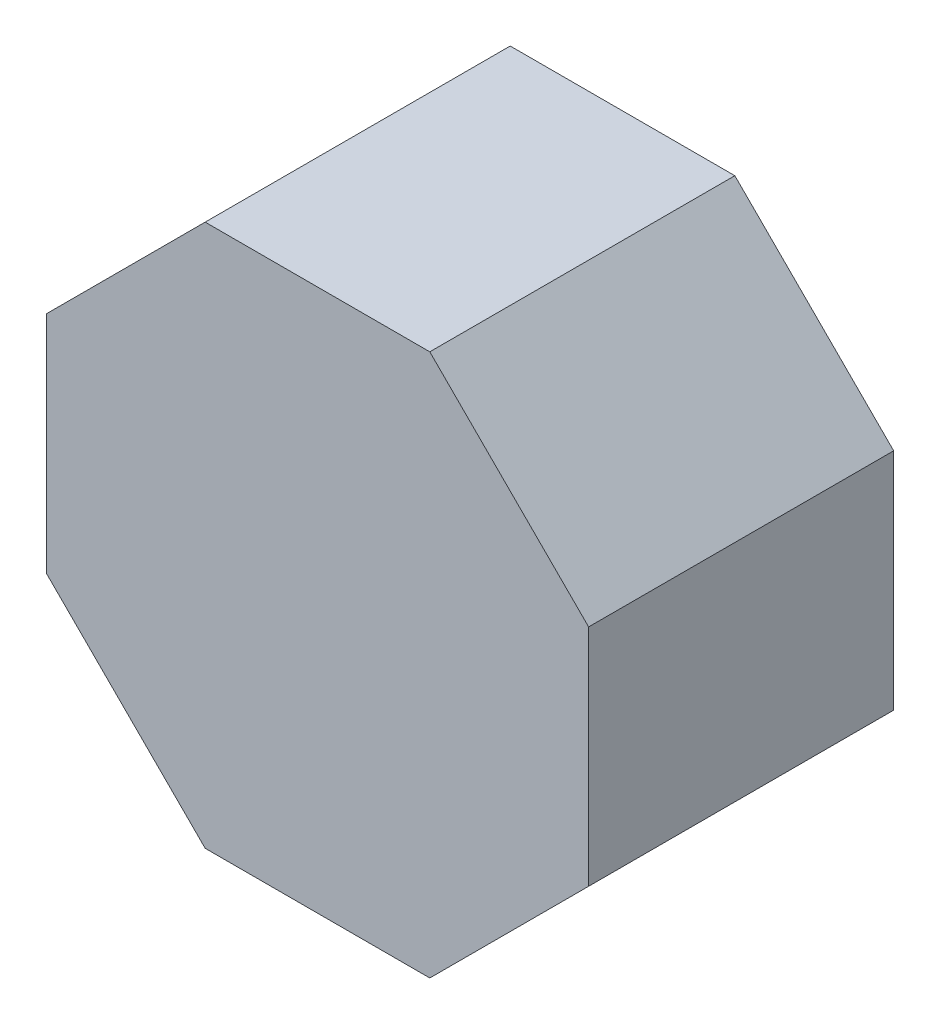
ISO-10303-21;
HEADER;
FILE_DESCRIPTION(('STEP AP214'),'2;1');
FILE_NAME('part.step','',(''),(''),'','','');
FILE_SCHEMA(('AUTOMOTIVE_DESIGN { 1 0 10303 214 1 1 1 1 }'));
ENDSEC;
DATA;
#1=APPLICATION_CONTEXT('core data for automotive mechanical design processes');
#2=APPLICATION_PROTOCOL_DEFINITION('international standard','automotive_design',2000,#1);
#3=PRODUCT_CONTEXT('',#1,'mechanical');
#4=PRODUCT('Part','Part','',(#3));
#5=PRODUCT_RELATED_PRODUCT_CATEGORY('part','',(#4));
#6=PRODUCT_DEFINITION_FORMATION('','',#4);
#7=PRODUCT_DEFINITION_CONTEXT('part definition',#1,'design');
#8=PRODUCT_DEFINITION('design','',#6,#7);
#9=PRODUCT_DEFINITION_SHAPE('','',#8);
#10=(LENGTH_UNIT() NAMED_UNIT(*) SI_UNIT(.MILLI.,.METRE.));
#11=(NAMED_UNIT(*) PLANE_ANGLE_UNIT() SI_UNIT($,.RADIAN.));
#12=(NAMED_UNIT(*) SI_UNIT($,.STERADIAN.) SOLID_ANGLE_UNIT());
#13=UNCERTAINTY_MEASURE_WITH_UNIT(LENGTH_MEASURE(1.E-05),#10,'distance_accuracy_value','');
#14=(GEOMETRIC_REPRESENTATION_CONTEXT(3) GLOBAL_UNCERTAINTY_ASSIGNED_CONTEXT((#13)) GLOBAL_UNIT_ASSIGNED_CONTEXT((#10,
#11,#12)) REPRESENTATION_CONTEXT('',''));
#15=CARTESIAN_POINT('',(0.,0.,0.));
#16=DIRECTION('',(0.,0.,1.));
#17=DIRECTION('',(1.,0.,0.));
#18=AXIS2_PLACEMENT_3D('',#15,#16,#17);
#19=CARTESIAN_POINT('',(-4.,1.65685424949238,4.5));
#20=DIRECTION('',(0.707106781186547,-0.707106781186547,0.));
#21=DIRECTION('',(0.707106781186548,0.707106781186548,0.));
#22=AXIS2_PLACEMENT_3D('',#19,#20,#21);
#23=PLANE('',#22);
#24=DIRECTION('',(-0.707106781186547,-0.707106781186547,0.));
#25=VECTOR('',#24,1.);
#26=CARTESIAN_POINT('',(-4.,1.65685424949238,0.));
#27=LINE('',#26,#25);
#28=CARTESIAN_POINT('',(-1.65685424949238,4.,0.));
#29=VERTEX_POINT('',#28);
#30=CARTESIAN_POINT('',(-4.,1.65685424949238,0.));
#31=VERTEX_POINT('',#30);
#32=EDGE_CURVE('E129',#29,#31,#27,.T.);
#33=ORIENTED_EDGE('',*,*,#32,.T.);
#34=DIRECTION('',(0.,0.,-1.));
#35=VECTOR('',#34,1.);
#36=CARTESIAN_POINT('',(-4.,1.65685424949238,4.5));
#37=LINE('',#36,#35);
#38=CARTESIAN_POINT('',(-4.,1.65685424949238,4.5));
#39=VERTEX_POINT('',#38);
#40=EDGE_CURVE('E11',#39,#31,#37,.T.);
#41=ORIENTED_EDGE('',*,*,#40,.F.);
#42=DIRECTION('',(-0.707106781186547,-0.707106781186547,0.));
#43=VECTOR('',#42,1.);
#44=CARTESIAN_POINT('',(-4.,1.65685424949238,4.5));
#45=LINE('',#44,#43);
#46=CARTESIAN_POINT('',(-1.65685424949238,4.,4.5));
#47=VERTEX_POINT('',#46);
#48=EDGE_CURVE('E143',#47,#39,#45,.T.);
#49=ORIENTED_EDGE('',*,*,#48,.F.);
#50=DIRECTION('',(0.,0.,-1.));
#51=VECTOR('',#50,1.);
#52=CARTESIAN_POINT('',(-1.65685424949238,4.,4.5));
#53=LINE('',#52,#51);
#54=EDGE_CURVE('E125',#47,#29,#53,.T.);
#55=ORIENTED_EDGE('',*,*,#54,.T.);
#56=EDGE_LOOP('',(#33,#41,#49,#55));
#57=FACE_BOUND('',#56,.T.);
#58=ADVANCED_FACE('F33',(#57),#23,.F.);
#59=CARTESIAN_POINT('',(-4.,-1.65685424949238,4.5));
#60=DIRECTION('',(1.,0.,0.));
#61=DIRECTION('',(0.,1.,0.));
#62=AXIS2_PLACEMENT_3D('',#59,#60,#61);
#63=PLANE('',#62);
#64=DIRECTION('',(0.,-1.,0.));
#65=VECTOR('',#64,1.);
#66=CARTESIAN_POINT('',(-4.,-1.65685424949238,0.));
#67=LINE('',#66,#65);
#68=CARTESIAN_POINT('',(-4.,-1.65685424949238,0.));
#69=VERTEX_POINT('',#68);
#70=EDGE_CURVE('E132',#31,#69,#67,.T.);
#71=ORIENTED_EDGE('',*,*,#70,.T.);
#72=DIRECTION('',(0.,0.,-1.));
#73=VECTOR('',#72,1.);
#74=CARTESIAN_POINT('',(-4.,-1.65685424949238,4.5));
#75=LINE('',#74,#73);
#76=CARTESIAN_POINT('',(-4.,-1.65685424949238,4.5));
#77=VERTEX_POINT('',#76);
#78=EDGE_CURVE('E41',#77,#69,#75,.T.);
#79=ORIENTED_EDGE('',*,*,#78,.F.);
#80=DIRECTION('',(0.,-1.,0.));
#81=VECTOR('',#80,1.);
#82=CARTESIAN_POINT('',(-4.,-1.65685424949238,4.5));
#83=LINE('',#82,#81);
#84=EDGE_CURVE('E92',#39,#77,#83,.T.);
#85=ORIENTED_EDGE('',*,*,#84,.F.);
#86=ORIENTED_EDGE('',*,*,#40,.T.);
#87=EDGE_LOOP('',(#71,#79,#85,#86));
#88=FACE_BOUND('',#87,.T.);
#89=ADVANCED_FACE('F178',(#88),#63,.F.);
#90=CARTESIAN_POINT('',(-1.65685424949238,-4.,4.5));
#91=DIRECTION('',(0.707106781186548,0.707106781186547,0.));
#92=DIRECTION('',(-0.707106781186547,0.707106781186548,0.));
#93=AXIS2_PLACEMENT_3D('',#90,#91,#92);
#94=PLANE('',#93);
#95=DIRECTION('',(0.707106781186547,-0.707106781186548,0.));
#96=VECTOR('',#95,1.);
#97=CARTESIAN_POINT('',(-1.65685424949238,-4.,0.));
#98=LINE('',#97,#96);
#99=CARTESIAN_POINT('',(-1.65685424949238,-4.,0.));
#100=VERTEX_POINT('',#99);
#101=EDGE_CURVE('E134',#69,#100,#98,.T.);
#102=ORIENTED_EDGE('',*,*,#101,.T.);
#103=DIRECTION('',(0.,0.,-1.));
#104=VECTOR('',#103,1.);
#105=CARTESIAN_POINT('',(-1.65685424949238,-4.,4.5));
#106=LINE('',#105,#104);
#107=CARTESIAN_POINT('',(-1.65685424949238,-4.,4.5));
#108=VERTEX_POINT('',#107);
#109=EDGE_CURVE('E150',#108,#100,#106,.T.);
#110=ORIENTED_EDGE('',*,*,#109,.F.);
#111=DIRECTION('',(0.707106781186547,-0.707106781186548,0.));
#112=VECTOR('',#111,1.);
#113=CARTESIAN_POINT('',(-1.65685424949238,-4.,4.5));
#114=LINE('',#113,#112);
#115=EDGE_CURVE('E158',#77,#108,#114,.T.);
#116=ORIENTED_EDGE('',*,*,#115,.F.);
#117=ORIENTED_EDGE('',*,*,#78,.T.);
#118=EDGE_LOOP('',(#102,#110,#116,#117));
#119=FACE_BOUND('',#118,.T.);
#120=ADVANCED_FACE('F156',(#119),#94,.F.);
#121=CARTESIAN_POINT('',(1.65685424949238,-4.,4.5));
#122=DIRECTION('',(0.,1.,0.));
#123=DIRECTION('',(-1.,0.,0.));
#124=AXIS2_PLACEMENT_3D('',#121,#122,#123);
#125=PLANE('',#124);
#126=DIRECTION('',(1.,0.,0.));
#127=VECTOR('',#126,1.);
#128=CARTESIAN_POINT('',(1.65685424949238,-4.,0.));
#129=LINE('',#128,#127);
#130=CARTESIAN_POINT('',(1.65685424949238,-4.,0.));
#131=VERTEX_POINT('',#130);
#132=EDGE_CURVE('E136',#100,#131,#129,.T.);
#133=ORIENTED_EDGE('',*,*,#132,.T.);
#134=DIRECTION('',(0.,0.,-1.));
#135=VECTOR('',#134,1.);
#136=CARTESIAN_POINT('',(1.65685424949238,-4.,4.5));
#137=LINE('',#136,#135);
#138=CARTESIAN_POINT('',(1.65685424949238,-4.,4.5));
#139=VERTEX_POINT('',#138);
#140=EDGE_CURVE('E147',#139,#131,#137,.T.);
#141=ORIENTED_EDGE('',*,*,#140,.F.);
#142=DIRECTION('',(1.,0.,0.));
#143=VECTOR('',#142,1.);
#144=CARTESIAN_POINT('',(1.65685424949238,-4.,4.5));
#145=LINE('',#144,#143);
#146=EDGE_CURVE('E170',#108,#139,#145,.T.);
#147=ORIENTED_EDGE('',*,*,#146,.F.);
#148=ORIENTED_EDGE('',*,*,#109,.T.);
#149=EDGE_LOOP('',(#133,#141,#147,#148));
#150=FACE_BOUND('',#149,.T.);
#151=ADVANCED_FACE('F166',(#150),#125,.F.);
#152=CARTESIAN_POINT('',(4.,-1.65685424949238,4.5));
#153=DIRECTION('',(-0.707106781186547,0.707106781186548,0.));
#154=DIRECTION('',(-0.707106781186548,-0.707106781186547,0.));
#155=AXIS2_PLACEMENT_3D('',#152,#153,#154);
#156=PLANE('',#155);
#157=DIRECTION('',(0.707106781186548,0.707106781186547,0.));
#158=VECTOR('',#157,1.);
#159=CARTESIAN_POINT('',(4.,-1.65685424949238,0.));
#160=LINE('',#159,#158);
#161=CARTESIAN_POINT('',(4.,-1.65685424949238,0.));
#162=VERTEX_POINT('',#161);
#163=EDGE_CURVE('E138',#131,#162,#160,.T.);
#164=ORIENTED_EDGE('',*,*,#163,.T.);
#165=DIRECTION('',(0.,0.,-1.));
#166=VECTOR('',#165,1.);
#167=CARTESIAN_POINT('',(4.,-1.65685424949238,4.5));
#168=LINE('',#167,#166);
#169=CARTESIAN_POINT('',(4.,-1.65685424949238,4.5));
#170=VERTEX_POINT('',#169);
#171=EDGE_CURVE('E120',#170,#162,#168,.T.);
#172=ORIENTED_EDGE('',*,*,#171,.F.);
#173=DIRECTION('',(0.707106781186548,0.707106781186547,0.));
#174=VECTOR('',#173,1.);
#175=CARTESIAN_POINT('',(4.,-1.65685424949238,4.5));
#176=LINE('',#175,#174);
#177=EDGE_CURVE('E111',#139,#170,#176,.T.);
#178=ORIENTED_EDGE('',*,*,#177,.F.);
#179=ORIENTED_EDGE('',*,*,#140,.T.);
#180=EDGE_LOOP('',(#164,#172,#178,#179));
#181=FACE_BOUND('',#180,.T.);
#182=ADVANCED_FACE('F169',(#181),#156,.F.);
#183=CARTESIAN_POINT('',(4.,1.65685424949238,4.5));
#184=DIRECTION('',(-1.,0.,0.));
#185=DIRECTION('',(0.,0.,1.));
#186=AXIS2_PLACEMENT_3D('',#183,#184,#185);
#187=PLANE('',#186);
#188=DIRECTION('',(0.,1.,0.));
#189=VECTOR('',#188,1.);
#190=CARTESIAN_POINT('',(4.,1.65685424949238,0.));
#191=LINE('',#190,#189);
#192=CARTESIAN_POINT('',(4.,1.65685424949238,0.));
#193=VERTEX_POINT('',#192);
#194=EDGE_CURVE('E119',#162,#193,#191,.T.);
#195=ORIENTED_EDGE('',*,*,#194,.T.);
#196=DIRECTION('',(0.,0.,-1.));
#197=VECTOR('',#196,1.);
#198=CARTESIAN_POINT('',(4.,1.65685424949238,4.5));
#199=LINE('',#198,#197);
#200=CARTESIAN_POINT('',(4.,1.65685424949238,4.5));
#201=VERTEX_POINT('',#200);
#202=EDGE_CURVE('E116',#201,#193,#199,.T.);
#203=ORIENTED_EDGE('',*,*,#202,.F.);
#204=DIRECTION('',(0.,1.,0.));
#205=VECTOR('',#204,1.);
#206=CARTESIAN_POINT('',(4.,1.65685424949238,4.5));
#207=LINE('',#206,#205);
#208=EDGE_CURVE('E105',#170,#201,#207,.T.);
#209=ORIENTED_EDGE('',*,*,#208,.F.);
#210=ORIENTED_EDGE('',*,*,#171,.T.);
#211=EDGE_LOOP('',(#195,#203,#209,#210));
#212=FACE_BOUND('',#211,.T.);
#213=ADVANCED_FACE('F117',(#212),#187,.F.);
#214=CARTESIAN_POINT('',(1.65685424949238,4.,4.5));
#215=DIRECTION('',(-0.707106781186547,-0.707106781186547,0.));
#216=DIRECTION('',(0.707106781186548,-0.707106781186548,0.));
#217=AXIS2_PLACEMENT_3D('',#214,#215,#216);
#218=PLANE('',#217);
#219=DIRECTION('',(-0.707106781186547,0.707106781186547,0.));
#220=VECTOR('',#219,1.);
#221=CARTESIAN_POINT('',(1.65685424949238,4.,0.));
#222=LINE('',#221,#220);
#223=CARTESIAN_POINT('',(1.65685424949238,4.,0.));
#224=VERTEX_POINT('',#223);
#225=EDGE_CURVE('E78',#193,#224,#222,.T.);
#226=ORIENTED_EDGE('',*,*,#225,.T.);
#227=DIRECTION('',(0.,0.,-1.));
#228=VECTOR('',#227,1.);
#229=CARTESIAN_POINT('',(1.65685424949238,4.,4.5));
#230=LINE('',#229,#228);
#231=CARTESIAN_POINT('',(1.65685424949238,4.,4.5));
#232=VERTEX_POINT('',#231);
#233=EDGE_CURVE('E121',#232,#224,#230,.T.);
#234=ORIENTED_EDGE('',*,*,#233,.F.);
#235=DIRECTION('',(-0.707106781186547,0.707106781186547,0.));
#236=VECTOR('',#235,1.);
#237=CARTESIAN_POINT('',(1.65685424949238,4.,4.5));
#238=LINE('',#237,#236);
#239=EDGE_CURVE('E109',#201,#232,#238,.T.);
#240=ORIENTED_EDGE('',*,*,#239,.F.);
#241=ORIENTED_EDGE('',*,*,#202,.T.);
#242=EDGE_LOOP('',(#226,#234,#240,#241));
#243=FACE_BOUND('',#242,.T.);
#244=ADVANCED_FACE('F123',(#243),#218,.F.);
#245=CARTESIAN_POINT('',(-1.65685424949238,4.,4.5));
#246=DIRECTION('',(0.,-1.,0.));
#247=DIRECTION('',(1.,0.,0.));
#248=AXIS2_PLACEMENT_3D('',#245,#246,#247);
#249=PLANE('',#248);
#250=DIRECTION('',(-1.,0.,0.));
#251=VECTOR('',#250,1.);
#252=CARTESIAN_POINT('',(-1.65685424949238,4.,0.));
#253=LINE('',#252,#251);
#254=EDGE_CURVE('E84',#224,#29,#253,.T.);
#255=ORIENTED_EDGE('',*,*,#254,.T.);
#256=ORIENTED_EDGE('',*,*,#54,.F.);
#257=DIRECTION('',(-1.,0.,0.));
#258=VECTOR('',#257,1.);
#259=CARTESIAN_POINT('',(-1.65685424949238,4.,4.5));
#260=LINE('',#259,#258);
#261=EDGE_CURVE('E49',#232,#47,#260,.T.);
#262=ORIENTED_EDGE('',*,*,#261,.F.);
#263=ORIENTED_EDGE('',*,*,#233,.T.);
#264=EDGE_LOOP('',(#255,#256,#262,#263));
#265=FACE_BOUND('',#264,.T.);
#266=ADVANCED_FACE('F194',(#265),#249,.F.);
#267=CARTESIAN_POINT('',(0.,0.,4.5));
#268=DIRECTION('',(0.,0.,-1.));
#269=DIRECTION('',(-1.,0.,0.));
#270=AXIS2_PLACEMENT_3D('',#267,#268,#269);
#271=PLANE('',#270);
#272=ORIENTED_EDGE('',*,*,#48,.T.);
#273=ORIENTED_EDGE('',*,*,#84,.T.);
#274=ORIENTED_EDGE('',*,*,#115,.T.);
#275=ORIENTED_EDGE('',*,*,#146,.T.);
#276=ORIENTED_EDGE('',*,*,#177,.T.);
#277=ORIENTED_EDGE('',*,*,#208,.T.);
#278=ORIENTED_EDGE('',*,*,#239,.T.);
#279=ORIENTED_EDGE('',*,*,#261,.T.);
#280=EDGE_LOOP('',(#272,#273,#274,#275,#276,#277,#278,#279));
#281=FACE_BOUND('',#280,.T.);
#282=ADVANCED_FACE('F107',(#281),#271,.F.);
#283=CARTESIAN_POINT('',(0.,0.,0.));
#284=DIRECTION('',(0.,0.,-1.));
#285=DIRECTION('',(-1.,0.,0.));
#286=AXIS2_PLACEMENT_3D('',#283,#284,#285);
#287=PLANE('',#286);
#288=ORIENTED_EDGE('',*,*,#32,.F.);
#289=ORIENTED_EDGE('',*,*,#254,.F.);
#290=ORIENTED_EDGE('',*,*,#225,.F.);
#291=ORIENTED_EDGE('',*,*,#194,.F.);
#292=ORIENTED_EDGE('',*,*,#163,.F.);
#293=ORIENTED_EDGE('',*,*,#132,.F.);
#294=ORIENTED_EDGE('',*,*,#101,.F.);
#295=ORIENTED_EDGE('',*,*,#70,.F.);
#296=EDGE_LOOP('',(#288,#289,#290,#291,#292,#293,#294,#295));
#297=FACE_BOUND('',#296,.T.);
#298=ADVANCED_FACE('F162',(#297),#287,.T.);
#299=CLOSED_SHELL('',(#58,#89,#120,#151,#182,#213,#244,#266,#282,#298));
#300=MANIFOLD_SOLID_BREP('B2',#299);
#301=ADVANCED_BREP_SHAPE_REPRESENTATION('',(#18,#300),#14);
#302=SHAPE_DEFINITION_REPRESENTATION(#9,#301);
ENDSEC;
END-ISO-10303-21;
